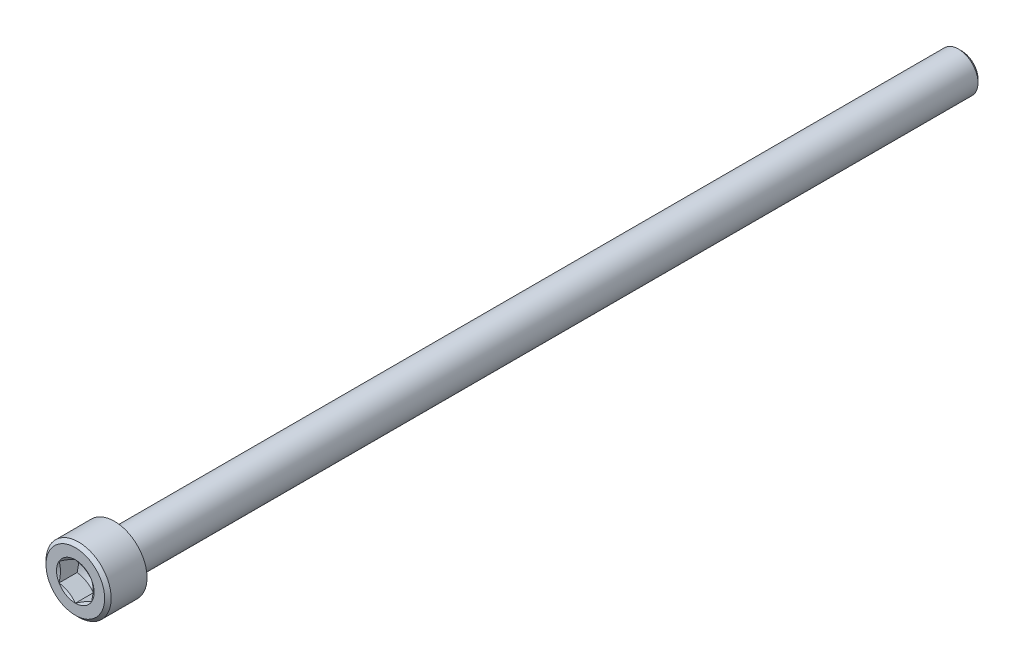
ISO-10303-21;
HEADER;
FILE_DESCRIPTION(('STEP AP214'),'2;1');
FILE_NAME('part.step','',(''),(''),'','','');
FILE_SCHEMA(('AUTOMOTIVE_DESIGN { 1 0 10303 214 1 1 1 1 }'));
ENDSEC;
DATA;
#1=APPLICATION_CONTEXT('core data for automotive mechanical design processes');
#2=APPLICATION_PROTOCOL_DEFINITION('international standard','automotive_design',2000,#1);
#3=PRODUCT_CONTEXT('',#1,'mechanical');
#4=PRODUCT('Part','Part','',(#3));
#5=PRODUCT_RELATED_PRODUCT_CATEGORY('part','',(#4));
#6=PRODUCT_DEFINITION_FORMATION('','',#4);
#7=PRODUCT_DEFINITION_CONTEXT('part definition',#1,'design');
#8=PRODUCT_DEFINITION('design','',#6,#7);
#9=PRODUCT_DEFINITION_SHAPE('','',#8);
#10=(LENGTH_UNIT() NAMED_UNIT(*) SI_UNIT(.MILLI.,.METRE.));
#11=(NAMED_UNIT(*) PLANE_ANGLE_UNIT() SI_UNIT($,.RADIAN.));
#12=(NAMED_UNIT(*) SI_UNIT($,.STERADIAN.) SOLID_ANGLE_UNIT());
#13=UNCERTAINTY_MEASURE_WITH_UNIT(LENGTH_MEASURE(1.E-05),#10,'distance_accuracy_value','');
#14=(GEOMETRIC_REPRESENTATION_CONTEXT(3) GLOBAL_UNCERTAINTY_ASSIGNED_CONTEXT((#13)) GLOBAL_UNIT_ASSIGNED_CONTEXT((#10,
#11,#12)) REPRESENTATION_CONTEXT('',''));
#15=CARTESIAN_POINT('',(0.,0.,0.));
#16=DIRECTION('',(0.,0.,1.));
#17=DIRECTION('',(1.,0.,0.));
#18=AXIS2_PLACEMENT_3D('',#15,#16,#17);
#19=CARTESIAN_POINT('',(0.,5.,6.));
#20=DIRECTION('',(0.,0.,-1.));
#21=DIRECTION('',(0.,1.,0.));
#22=AXIS2_PLACEMENT_3D('',#19,#20,#21);
#23=PLANE('',#22);
#24=CARTESIAN_POINT('',(0.,0.,6.));
#25=DIRECTION('',(0.,0.,-1.));
#26=DIRECTION('',(0.,1.,0.));
#27=AXIS2_PLACEMENT_3D('',#24,#25,#26);
#28=CIRCLE('',#27,4.50000000000001);
#29=CARTESIAN_POINT('',(0.,4.50000000000001,6.));
#30=VERTEX_POINT('',#29);
#31=EDGE_CURVE('E284',#30,#30,#28,.F.);
#32=ORIENTED_EDGE('',*,*,#31,.T.);
#33=EDGE_LOOP('',(#32));
#34=FACE_BOUND('',#33,.T.);
#35=CARTESIAN_POINT('',(0.,0.,6.));
#36=DIRECTION('',(0.,0.,-1.));
#37=DIRECTION('',(0.,1.,0.));
#38=AXIS2_PLACEMENT_3D('',#35,#36,#37);
#39=CIRCLE('',#38,2.88675134594813);
#40=CARTESIAN_POINT('',(0.,2.88675134594813,6.));
#41=VERTEX_POINT('',#40);
#42=CARTESIAN_POINT('',(-2.5,1.44337567297407,6.));
#43=VERTEX_POINT('',#42);
#44=EDGE_CURVE('E105',#41,#43,#39,.F.);
#45=ORIENTED_EDGE('',*,*,#44,.F.);
#46=CARTESIAN_POINT('',(2.5,1.44337567297406,6.));
#47=VERTEX_POINT('',#46);
#48=EDGE_CURVE('E93',#47,#41,#39,.F.);
#49=ORIENTED_EDGE('',*,*,#48,.F.);
#50=CARTESIAN_POINT('',(2.5,-1.44337567297406,6.));
#51=VERTEX_POINT('',#50);
#52=EDGE_CURVE('E103',#51,#47,#39,.F.);
#53=ORIENTED_EDGE('',*,*,#52,.F.);
#54=CARTESIAN_POINT('',(0.,-2.88675134594813,6.));
#55=VERTEX_POINT('',#54);
#56=EDGE_CURVE('E451',#55,#51,#39,.F.);
#57=ORIENTED_EDGE('',*,*,#56,.F.);
#58=CARTESIAN_POINT('',(-2.5,-1.44337567297502,5.99999999999936));
#59=VERTEX_POINT('',#58);
#60=EDGE_CURVE('E140',#59,#55,#39,.F.);
#61=ORIENTED_EDGE('',*,*,#60,.F.);
#62=EDGE_CURVE('E135',#43,#59,#39,.F.);
#63=ORIENTED_EDGE('',*,*,#62,.F.);
#64=EDGE_LOOP('',(#45,#49,#53,#57,#61,#63));
#65=FACE_BOUND('',#64,.T.);
#66=ADVANCED_FACE('F36',(#34,#65),#23,.F.);
#67=CARTESIAN_POINT('',(0.,3.,0.));
#68=DIRECTION('',(0.,0.,1.));
#69=DIRECTION('',(0.,-1.,0.));
#70=AXIS2_PLACEMENT_3D('',#67,#68,#69);
#71=PLANE('',#70);
#72=CARTESIAN_POINT('',(0.,0.,0.));
#73=DIRECTION('',(0.,0.,1.));
#74=DIRECTION('',(0.,-1.,0.));
#75=AXIS2_PLACEMENT_3D('',#72,#73,#74);
#76=CIRCLE('',#75,3.25);
#77=CARTESIAN_POINT('',(0.,-3.25,0.));
#78=VERTEX_POINT('',#77);
#79=EDGE_CURVE('E45',#78,#78,#76,.T.);
#80=ORIENTED_EDGE('',*,*,#79,.T.);
#81=EDGE_LOOP('',(#80));
#82=FACE_BOUND('',#81,.T.);
#83=CARTESIAN_POINT('',(0.,0.,0.));
#84=DIRECTION('',(0.,0.,1.));
#85=DIRECTION('',(0.,-1.,0.));
#86=AXIS2_PLACEMENT_3D('',#83,#84,#85);
#87=CIRCLE('',#86,5.);
#88=CARTESIAN_POINT('',(0.,-5.,0.));
#89=VERTEX_POINT('',#88);
#90=EDGE_CURVE('E480',#89,#89,#87,.T.);
#91=ORIENTED_EDGE('',*,*,#90,.F.);
#92=EDGE_LOOP('',(#91));
#93=FACE_BOUND('',#92,.T.);
#94=ADVANCED_FACE('F244',(#82,#93),#71,.F.);
#95=CARTESIAN_POINT('',(0.,0.,6.));
#96=DIRECTION('',(0.,0.,1.));
#97=DIRECTION('',(0.,-1.,0.));
#98=AXIS2_PLACEMENT_3D('',#95,#96,#97);
#99=CYLINDRICAL_SURFACE('',#98,5.);
#100=CARTESIAN_POINT('',(0.,0.,5.50000000000001));
#101=DIRECTION('',(0.,0.,-1.));
#102=DIRECTION('',(0.,1.,0.));
#103=AXIS2_PLACEMENT_3D('',#100,#101,#102);
#104=CIRCLE('',#103,5.);
#105=CARTESIAN_POINT('',(0.,5.,5.50000000000001));
#106=VERTEX_POINT('',#105);
#107=EDGE_CURVE('E277',#106,#106,#104,.T.);
#108=ORIENTED_EDGE('',*,*,#107,.T.);
#109=EDGE_LOOP('',(#108));
#110=FACE_BOUND('',#109,.T.);
#111=ORIENTED_EDGE('',*,*,#90,.T.);
#112=EDGE_LOOP('',(#111));
#113=FACE_BOUND('',#112,.T.);
#114=ADVANCED_FACE('F250',(#110,#113),#99,.T.);
#115=CARTESIAN_POINT('',(0.,0.,-130.));
#116=DIRECTION('',(0.,0.,1.));
#117=DIRECTION('',(0.,-1.,0.));
#118=AXIS2_PLACEMENT_3D('',#115,#116,#117);
#119=PLANE('',#118);
#120=CARTESIAN_POINT('',(0.,0.,-130.));
#121=DIRECTION('',(0.,0.,1.));
#122=DIRECTION('',(0.,-1.,0.));
#123=AXIS2_PLACEMENT_3D('',#120,#121,#122);
#124=CIRCLE('',#123,2.50000000000001);
#125=CARTESIAN_POINT('',(0.,-2.50000000000001,-130.));
#126=VERTEX_POINT('',#125);
#127=EDGE_CURVE('E116',#126,#126,#124,.F.);
#128=ORIENTED_EDGE('',*,*,#127,.T.);
#129=EDGE_LOOP('',(#128));
#130=FACE_BOUND('',#129,.T.);
#131=ADVANCED_FACE('F255',(#130),#119,.F.);
#132=CARTESIAN_POINT('',(0.,0.,6.));
#133=DIRECTION('',(0.,0.,1.));
#134=DIRECTION('',(0.,-1.,0.));
#135=AXIS2_PLACEMENT_3D('',#132,#133,#134);
#136=CYLINDRICAL_SURFACE('',#135,3.);
#137=CARTESIAN_POINT('',(0.,0.,-0.25));
#138=DIRECTION('',(0.,0.,1.));
#139=DIRECTION('',(0.,-1.,0.));
#140=AXIS2_PLACEMENT_3D('',#137,#138,#139);
#141=CIRCLE('',#140,3.);
#142=CARTESIAN_POINT('',(0.,-3.,-0.25));
#143=VERTEX_POINT('',#142);
#144=EDGE_CURVE('E12',#143,#143,#141,.F.);
#145=ORIENTED_EDGE('',*,*,#144,.T.);
#146=EDGE_LOOP('',(#145));
#147=FACE_BOUND('',#146,.T.);
#148=CARTESIAN_POINT('',(0.,0.,-129.5));
#149=DIRECTION('',(0.,0.,1.));
#150=DIRECTION('',(0.,-1.,0.));
#151=AXIS2_PLACEMENT_3D('',#148,#149,#150);
#152=CIRCLE('',#151,3.);
#153=CARTESIAN_POINT('',(0.,-3.,-129.5));
#154=VERTEX_POINT('',#153);
#155=EDGE_CURVE('E274',#154,#154,#152,.T.);
#156=ORIENTED_EDGE('',*,*,#155,.T.);
#157=EDGE_LOOP('',(#156));
#158=FACE_BOUND('',#157,.T.);
#159=ADVANCED_FACE('F172',(#147,#158),#136,.T.);
#160=CARTESIAN_POINT('',(0.,0.,6.));
#161=DIRECTION('',(0.,0.,-1.));
#162=DIRECTION('',(0.,1.,0.));
#163=AXIS2_PLACEMENT_3D('',#160,#161,#162);
#164=CONICAL_SURFACE('',#163,4.50000000000001,0.785398163397447);
#165=ORIENTED_EDGE('',*,*,#107,.F.);
#166=EDGE_LOOP('',(#165));
#167=FACE_BOUND('',#166,.T.);
#168=ORIENTED_EDGE('',*,*,#31,.F.);
#169=EDGE_LOOP('',(#168));
#170=FACE_BOUND('',#169,.T.);
#171=ADVANCED_FACE('F259',(#167,#170),#164,.T.);
#172=CARTESIAN_POINT('',(0.,0.,-129.5));
#173=DIRECTION('',(0.,0.,1.));
#174=DIRECTION('',(0.,-1.,0.));
#175=AXIS2_PLACEMENT_3D('',#172,#173,#174);
#176=CONICAL_SURFACE('',#175,3.,0.785398163397438);
#177=ORIENTED_EDGE('',*,*,#127,.F.);
#178=EDGE_LOOP('',(#177));
#179=FACE_BOUND('',#178,.T.);
#180=ORIENTED_EDGE('',*,*,#155,.F.);
#181=EDGE_LOOP('',(#180));
#182=FACE_BOUND('',#181,.T.);
#183=ADVANCED_FACE('F261',(#179,#182),#176,.T.);
#184=CARTESIAN_POINT('',(0.,0.,5.7767090063074));
#185=DIRECTION('',(0.,0.,1.));
#186=DIRECTION('',(0.,-1.,0.));
#187=AXIS2_PLACEMENT_3D('',#184,#185,#186);
#188=CONICAL_SURFACE('',#187,2.5,1.04719755119659);
#189=ORIENTED_EDGE('',*,*,#44,.T.);
#190=CARTESIAN_POINT('',(-2.5002,1.44326020292023,6.00006667066651));
#191=CARTESIAN_POINT('',(-2.39033676526513,1.50668977106845,5.96343062641502));
#192=CARTESIAN_POINT('',(-2.27952520010347,1.57066685804385,5.93011122527245));
#193=CARTESIAN_POINT('',(-2.05598316653395,1.69972891130041,5.87195129186525));
#194=CARTESIAN_POINT('',(-1.94324872547161,1.7648161711947,5.84713133545513));
#195=CARTESIAN_POINT('',(-1.71917700612473,1.8941840386774,5.80849465774845));
#196=CARTESIAN_POINT('',(-1.60787420823262,1.95844473900197,5.79442080249303));
#197=CARTESIAN_POINT('',(-1.38474477253166,2.08726857876805,5.77761815866015));
#198=CARTESIAN_POINT('',(-1.27291894598577,2.15183124982667,5.77487545751102));
#199=CARTESIAN_POINT('',(-1.06395802444848,2.27247489412634,5.78057476631545));
#200=CARTESIAN_POINT('',(-0.966791682442266,2.32857390783979,5.78761740068926));
#201=CARTESIAN_POINT('',(-0.773092050288996,2.44040644260542,5.80994042543234));
#202=CARTESIAN_POINT('',(-0.676559430340266,2.4961395767184,5.82522844474766));
#203=CARTESIAN_POINT('',(-0.482460278259523,2.60820277442169,5.86344810015182));
#204=CARTESIAN_POINT('',(-0.384918318217859,2.66451865130903,5.88654178243291));
#205=CARTESIAN_POINT('',(-0.191289391923915,2.77631036402774,5.93895566288531));
#206=CARTESIAN_POINT('',(-0.0951999441138238,2.83178763258718,5.96826354193195));
#207=CARTESIAN_POINT('',(0.000200000000000195,2.88686681600197,6.00006667066651));
#208=B_SPLINE_CURVE_WITH_KNOTS('',3,(#190,#191,#192,#193,#194,#195,#196,#197,#198,#199,#200,
#201,#202,#203,#204,#205,#206,#207),.UNSPECIFIED.,.F.,.F.,(4,2,2,2,2,2,2,2,4),(0.,
0.396285827362227,0.793524330152053,1.18093086852114,1.56786160134476,1.90479741793733,
2.24204551660463,2.58677531536756,2.93082800105256),.UNSPECIFIED.);
#209=EDGE_CURVE('E109',#43,#41,#208,.T.);
#210=ORIENTED_EDGE('',*,*,#209,.T.);
#211=EDGE_LOOP('',(#189,#210));
#212=FACE_BOUND('',#211,.T.);
#213=ADVANCED_FACE('F110',(#212),#188,.F.);
#214=ORIENTED_EDGE('',*,*,#62,.T.);
#215=CARTESIAN_POINT('',(-2.5,-3.8280449937249,6.97302576958309));
#216=CARTESIAN_POINT('',(-2.5,-3.7182808564923,6.91998167553699));
#217=CARTESIAN_POINT('',(-2.5,-3.60825720059611,6.8674648836873));
#218=CARTESIAN_POINT('',(-2.5,-3.38755052986278,6.76378722305589));
#219=CARTESIAN_POINT('',(-2.5,-3.27686740487511,6.71262658903718));
#220=CARTESIAN_POINT('',(-2.5,-3.05410357304014,6.61169304571925));
#221=CARTESIAN_POINT('',(-2.5,-2.94201849305906,6.56192975322204));
#222=CARTESIAN_POINT('',(-2.5,-2.71692709217093,6.46454062219532));
#223=CARTESIAN_POINT('',(-2.5,-2.60392081964764,6.41691467225014));
#224=CARTESIAN_POINT('',(-2.5,-2.37540441715663,6.32380316280409));
#225=CARTESIAN_POINT('',(-2.5,-2.25988058014283,6.2783510589425));
#226=CARTESIAN_POINT('',(-2.5,-2.02747029246906,6.19100665065722));
#227=CARTESIAN_POINT('',(-2.5,-1.91058369184926,6.14911474228664));
#228=CARTESIAN_POINT('',(-2.5,-1.67550198908655,6.07001634907686));
#229=CARTESIAN_POINT('',(-2.5,-1.55731027320578,6.03279990304744));
#230=CARTESIAN_POINT('',(-2.5,-1.31924659147454,5.96426110414784));
#231=CARTESIAN_POINT('',(-2.5,-1.19937516991139,5.93293688735548));
#232=CARTESIAN_POINT('',(-2.5,-0.957870204364199,5.87770325315376));
#233=CARTESIAN_POINT('',(-2.5,-0.836236200198253,5.85379581003031));
#234=CARTESIAN_POINT('',(-2.5,-0.591501703670775,5.81500540375892));
#235=CARTESIAN_POINT('',(-2.5,-0.468401210012781,5.80012244858975));
#236=CARTESIAN_POINT('',(-2.5,-0.222157493517872,5.78069763952581));
#237=CARTESIAN_POINT('',(-2.5,-0.0990195694341574,5.77609031833175));
#238=CARTESIAN_POINT('',(-2.5,0.147170053504283,5.77746154779163));
#239=CARTESIAN_POINT('',(-2.5,0.270221766444751,5.78343735056697));
#240=CARTESIAN_POINT('',(-2.5,0.480350397015566,5.80225821544085));
#241=CARTESIAN_POINT('',(-2.5,0.567659136488241,5.81265231633479));
#242=CARTESIAN_POINT('',(-2.5,0.741602181646435,5.83809238777401));
#243=CARTESIAN_POINT('',(-2.5,0.828236378755897,5.85313909196885));
#244=CARTESIAN_POINT('',(-2.5,1.08705653408058,5.90446842565118));
#245=CARTESIAN_POINT('',(-2.5,1.25802931580402,5.94692706032299));
#246=CARTESIAN_POINT('',(-2.5,1.51386408134024,6.02015673088049));
#247=CARTESIAN_POINT('',(-2.5,1.60005960225907,6.0465302199395));
#248=CARTESIAN_POINT('',(-2.5,1.7715509943832,6.10188686894956));
#249=CARTESIAN_POINT('',(-2.5,1.85684744139665,6.13086822892402));
#250=CARTESIAN_POINT('',(-2.5,2.02618400322653,6.19083756829486));
#251=CARTESIAN_POINT('',(-2.5,2.11022848716712,6.22181333490311));
#252=CARTESIAN_POINT('',(-2.5,2.27766538220508,6.28558297742634));
#253=CARTESIAN_POINT('',(-2.5,2.36105751399552,6.31837758815925));
#254=CARTESIAN_POINT('',(-2.5,2.44414811866612,6.35190213539576));
#255=B_SPLINE_CURVE_WITH_KNOTS('',3,(#215,#216,#217,#218,#219,#220,#221,#222,#223,#224,#225,
#226,#227,#228,#229,#230,#231,#232,#233,#234,#235,#236,#237,#238,#239,#240,#241,#242,#243,#244,
#245,#246,#247,#248,#249,#250,#251,#252,#253,#254),.UNSPECIFIED.,.F.,.F.,(4,2,2,2,2,2,2,2,2,2,2,
2,2,2,2,2,2,2,2,4),(0.,0.365732370332687,0.731527644124578,1.09941621653749,1.46728558928024,
1.83967125623437,2.21209829506693,2.58371790436015,2.95521975869687,3.32682041917424,
3.69842140819281,4.06764803658798,4.43677881037457,4.70042588015974,4.96411454456794,
5.49188432099904,5.76228301186062,6.03249648197688,6.30118900914354,6.56999089095287),.UNSPECIFIED.);
#256=EDGE_CURVE('E227',#59,#43,#255,.T.);
#257=ORIENTED_EDGE('',*,*,#256,.T.);
#258=EDGE_LOOP('',(#214,#257));
#259=FACE_BOUND('',#258,.T.);
#260=ADVANCED_FACE('F268',(#259),#188,.F.);
#261=ORIENTED_EDGE('',*,*,#60,.T.);
#262=CARTESIAN_POINT('',(0.000200000000001086,-2.88686681600197,6.00006667066651));
#263=CARTESIAN_POINT('',(-0.10966323473487,-2.82343724785375,5.96343062641502));
#264=CARTESIAN_POINT('',(-0.220474799896525,-2.75946016087834,5.93011122527245));
#265=CARTESIAN_POINT('',(-0.444016833466049,-2.63039810762178,5.87195129186525));
#266=CARTESIAN_POINT('',(-0.556751274528388,-2.5653108477275,5.84713133545513));
#267=CARTESIAN_POINT('',(-0.78082299387527,-2.43594298024479,5.80849465774845));
#268=CARTESIAN_POINT('',(-0.892125791767378,-2.37168227992022,5.79442080249303));
#269=CARTESIAN_POINT('',(-1.11525522746834,-2.24285844015415,5.77761815866014));
#270=CARTESIAN_POINT('',(-1.22708105401423,-2.17829576909552,5.77487545751102));
#271=CARTESIAN_POINT('',(-1.43604197555152,-2.05765212479586,5.78057476631545));
#272=CARTESIAN_POINT('',(-1.53320831755773,-2.0015531110824,5.78761740068926));
#273=CARTESIAN_POINT('',(-1.726907949711,-1.88972057631678,5.80994042543234));
#274=CARTESIAN_POINT('',(-1.82344056965973,-1.8339874422038,5.82522844474766));
#275=CARTESIAN_POINT('',(-2.01753972174048,-1.7219242445005,5.86344810015182));
#276=CARTESIAN_POINT('',(-2.11508168178214,-1.66560836761316,5.88654178243291));
#277=CARTESIAN_POINT('',(-2.30871060807608,-1.55381665489446,5.93895566288531));
#278=CARTESIAN_POINT('',(-2.40480005588618,-1.49833938633502,5.96826354193195));
#279=CARTESIAN_POINT('',(-2.5002,-1.44326020292023,6.00006667066651));
#280=B_SPLINE_CURVE_WITH_KNOTS('',3,(#262,#263,#264,#265,#266,#267,#268,#269,#270,#271,#272,
#273,#274,#275,#276,#277,#278,#279),.UNSPECIFIED.,.F.,.F.,(4,2,2,2,2,2,2,2,4),(0.,
0.396285827362228,0.793524330152053,1.18093086852114,1.56786160134476,1.90479741793733,
2.24204551660463,2.58677531536756,2.93082800105257),.UNSPECIFIED.);
#281=EDGE_CURVE('E221',#55,#59,#280,.T.);
#282=ORIENTED_EDGE('',*,*,#281,.T.);
#283=EDGE_LOOP('',(#261,#282));
#284=FACE_BOUND('',#283,.T.);
#285=ADVANCED_FACE('F381',(#284),#188,.F.);
#286=ORIENTED_EDGE('',*,*,#56,.T.);
#287=CARTESIAN_POINT('',(2.5002,-1.44326020292023,6.00006667066651));
#288=CARTESIAN_POINT('',(2.39033676526513,-1.50668977106845,5.96343062641502));
#289=CARTESIAN_POINT('',(2.27952520010347,-1.57066685804385,5.93011122527245));
#290=CARTESIAN_POINT('',(2.05598316653395,-1.69972891130041,5.87195129186525));
#291=CARTESIAN_POINT('',(1.94324872547161,-1.7648161711947,5.84713133545513));
#292=CARTESIAN_POINT('',(1.71917700612473,-1.8941840386774,5.80849465774845));
#293=CARTESIAN_POINT('',(1.60787420823262,-1.95844473900197,5.79442080249303));
#294=CARTESIAN_POINT('',(1.38474477253166,-2.08726857876805,5.77761815866015));
#295=CARTESIAN_POINT('',(1.27291894598577,-2.15183124982667,5.77487545751102));
#296=CARTESIAN_POINT('',(1.06395802444848,-2.27247489412634,5.78057476631545));
#297=CARTESIAN_POINT('',(0.966791682442267,-2.32857390783979,5.78761740068926));
#298=CARTESIAN_POINT('',(0.773092050288996,-2.44040644260542,5.80994042543234));
#299=CARTESIAN_POINT('',(0.676559430340266,-2.4961395767184,5.82522844474766));
#300=CARTESIAN_POINT('',(0.482460278259523,-2.60820277442169,5.86344810015182));
#301=CARTESIAN_POINT('',(0.384918318217859,-2.66451865130903,5.88654178243292));
#302=CARTESIAN_POINT('',(0.191289391923915,-2.77631036402774,5.93895566288531));
#303=CARTESIAN_POINT('',(0.0951999441138246,-2.83178763258717,5.96826354193195));
#304=CARTESIAN_POINT('',(-0.000199999999999224,-2.88686681600197,6.00006667066651));
#305=B_SPLINE_CURVE_WITH_KNOTS('',3,(#287,#288,#289,#290,#291,#292,#293,#294,#295,#296,#297,
#298,#299,#300,#301,#302,#303,#304),.UNSPECIFIED.,.F.,.F.,(4,2,2,2,2,2,2,2,4),(0.,
0.396285827362228,0.793524330152053,1.18093086852114,1.56786160134476,1.90479741793733,
2.24204551660463,2.58677531536756,2.93082800105256),.UNSPECIFIED.);
#306=EDGE_CURVE('E57',#51,#55,#305,.T.);
#307=ORIENTED_EDGE('',*,*,#306,.T.);
#308=EDGE_LOOP('',(#286,#307));
#309=FACE_BOUND('',#308,.T.);
#310=ADVANCED_FACE('F389',(#309),#188,.F.);
#311=ORIENTED_EDGE('',*,*,#52,.T.);
#312=CARTESIAN_POINT('',(2.5,-3.82804588606158,6.97302620093449));
#313=CARTESIAN_POINT('',(2.5,-3.71828171828268,6.91998208843203));
#314=CARTESIAN_POINT('',(2.5,-3.60825803181684,6.86746527813683));
#315=CARTESIAN_POINT('',(2.5,-3.38755129984201,6.76378758071264));
#316=CARTESIAN_POINT('',(2.5,-3.27686814418247,6.71262692834667));
#317=CARTESIAN_POINT('',(2.5,-3.05410425049089,6.61169334832497));
#318=CARTESIAN_POINT('',(2.5,-2.94201913932292,6.56193003747517));
#319=CARTESIAN_POINT('',(2.5,-2.71692767582903,6.46454087008096));
#320=CARTESIAN_POINT('',(2.5,-2.60392137188689,6.41691490212086));
#321=CARTESIAN_POINT('',(2.5,-2.37540490571202,6.32380335695479));
#322=CARTESIAN_POINT('',(2.5,-2.25988103642781,6.27835123539776));
#323=CARTESIAN_POINT('',(2.5,-2.02747068367306,6.19100679270298));
#324=CARTESIAN_POINT('',(2.5,-1.91058405024255,6.1491148676187));
#325=CARTESIAN_POINT('',(2.5,-1.67550228123859,6.07001644264555));
#326=CARTESIAN_POINT('',(2.5,-1.55731053192955,6.03279998156106));
#327=CARTESIAN_POINT('',(2.5,-1.31924678242158,5.96426115509875));
#328=CARTESIAN_POINT('',(2.5,-1.19937532651053,5.9329369257971));
#329=CARTESIAN_POINT('',(2.5,-0.957870273262473,5.87770326628756));
#330=CARTESIAN_POINT('',(2.5,-0.836236215486562,5.85379581146796));
#331=CARTESIAN_POINT('',(2.5,-0.591501610534911,5.81500538998051));
#332=CARTESIAN_POINT('',(2.5,-0.468401062063661,5.80012243128558));
#333=CARTESIAN_POINT('',(2.5,-0.22215723620717,5.78069762481882));
#334=CARTESIAN_POINT('',(2.5,-0.0990192575787284,5.77609030966701));
#335=CARTESIAN_POINT('',(2.5,0.1471704735209,5.77746156052538));
#336=CARTESIAN_POINT('',(2.5,0.270222240078057,5.78343737865902));
#337=CARTESIAN_POINT('',(2.5,0.480350939206177,5.80225827428052));
#338=CARTESIAN_POINT('',(2.5,0.567659694215581,5.81265238748117));
#339=CARTESIAN_POINT('',(2.5,0.741602769794541,5.8380924842116));
#340=CARTESIAN_POINT('',(2.5,0.828236981787935,5.85313920139105));
#341=CARTESIAN_POINT('',(2.5,1.08705718104795,5.90446857434287));
#342=CARTESIAN_POINT('',(2.5,1.25802999101339,5.94692723558926));
#343=CARTESIAN_POINT('',(2.5,1.51386479875968,6.02015694545726));
#344=CARTESIAN_POINT('',(2.5,1.60006033398193,6.04653044771448));
#345=CARTESIAN_POINT('',(2.5,1.77155175455052,6.10188712274017));
#346=CARTESIAN_POINT('',(2.5,1.85684821570523,6.13086849553187));
#347=CARTESIAN_POINT('',(2.5,2.02618480561253,6.19083786003536));
#348=CARTESIAN_POINT('',(2.5,2.11022930349026,6.22181363895937));
#349=CARTESIAN_POINT('',(2.5,2.27766622643295,6.28558330574319));
#350=CARTESIAN_POINT('',(2.5,2.36105837219078,6.31837792842132));
#351=CARTESIAN_POINT('',(2.5,2.44414899085237,6.35190248741952));
#352=B_SPLINE_CURVE_WITH_KNOTS('',3,(#312,#313,#314,#315,#316,#317,#318,#319,#320,#321,#322,
#323,#324,#325,#326,#327,#328,#329,#330,#331,#332,#333,#334,#335,#336,#337,#338,#339,#340,#341,
#342,#343,#344,#345,#346,#347,#348,#349,#350,#351),.UNSPECIFIED.,.F.,.F.,(4,2,2,2,2,2,2,2,2,2,2,
2,2,2,2,2,2,2,2,4),(0.,0.365732476934658,0.731527857346204,1.09941653761223,1.46728601819945,
1.83967179466916,2.21209894305431,2.58371866150582,2.95522062491228,3.32682144960046,
3.69842260258812,4.06764939320248,4.4367803293227,4.700427449745,4.9641161647987,
5.49188604280505,5.76228478630214,6.03249830897401,6.30119088816191,6.56999282209524),.UNSPECIFIED.);
#353=EDGE_CURVE('E51',#47,#51,#352,.F.);
#354=ORIENTED_EDGE('',*,*,#353,.T.);
#355=EDGE_LOOP('',(#311,#354));
#356=FACE_BOUND('',#355,.T.);
#357=ADVANCED_FACE('F397',(#356),#188,.F.);
#358=ORIENTED_EDGE('',*,*,#48,.T.);
#359=CARTESIAN_POINT('',(-0.000200000000000008,2.88686681600197,6.00006667066651));
#360=CARTESIAN_POINT('',(0.109663234734871,2.82343724785375,5.96343062641502));
#361=CARTESIAN_POINT('',(0.220474799896526,2.75946016087834,5.93011122527245));
#362=CARTESIAN_POINT('',(0.44401683346605,2.63039810762178,5.87195129186525));
#363=CARTESIAN_POINT('',(0.556751274528389,2.5653108477275,5.84713133545513));
#364=CARTESIAN_POINT('',(0.78082299387527,2.43594298024479,5.80849465774845));
#365=CARTESIAN_POINT('',(0.892125791767379,2.37168227992022,5.79442080249303));
#366=CARTESIAN_POINT('',(1.11525522746834,2.24285844015415,5.77761815866014));
#367=CARTESIAN_POINT('',(1.22708105401423,2.17829576909552,5.77487545751102));
#368=CARTESIAN_POINT('',(1.43604197555152,2.05765212479585,5.78057476631545));
#369=CARTESIAN_POINT('',(1.53320831755773,2.0015531110824,5.78761740068926));
#370=CARTESIAN_POINT('',(1.726907949711,1.88972057631678,5.80994042543234));
#371=CARTESIAN_POINT('',(1.82344056965973,1.8339874422038,5.82522844474766));
#372=CARTESIAN_POINT('',(2.01753972174048,1.7219242445005,5.86344810015182));
#373=CARTESIAN_POINT('',(2.11508168178214,1.66560836761316,5.88654178243291));
#374=CARTESIAN_POINT('',(2.30871060807608,1.55381665489446,5.93895566288531));
#375=CARTESIAN_POINT('',(2.40480005588618,1.49833938633502,5.96826354193195));
#376=CARTESIAN_POINT('',(2.5002,1.44326020292023,6.00006667066651));
#377=B_SPLINE_CURVE_WITH_KNOTS('',3,(#359,#360,#361,#362,#363,#364,#365,#366,#367,#368,#369,
#370,#371,#372,#373,#374,#375,#376),.UNSPECIFIED.,.F.,.F.,(4,2,2,2,2,2,2,2,4),(0.,
0.396285827362228,0.793524330152053,1.18093086852114,1.56786160134476,1.90479741793733,
2.24204551660463,2.58677531536756,2.93082800105256),.UNSPECIFIED.);
#378=EDGE_CURVE('E97',#41,#47,#377,.T.);
#379=ORIENTED_EDGE('',*,*,#378,.T.);
#380=EDGE_LOOP('',(#358,#379));
#381=FACE_BOUND('',#380,.T.);
#382=ADVANCED_FACE('F95',(#381),#188,.F.);
#383=CARTESIAN_POINT('',(0.,0.,1.55662432702594));
#384=DIRECTION('',(0.,0.,1.));
#385=DIRECTION('',(1.,0.,0.));
#386=AXIS2_PLACEMENT_3D('',#383,#384,#385);
#387=CONICAL_SURFACE('',#386,0.,1.0471975511966);
#388=CARTESIAN_POINT('',(2.5002,-1.44326020292023,3.22335766435911));
#389=CARTESIAN_POINT('',(2.39033676526513,-1.50668977106845,3.18672162010763));
#390=CARTESIAN_POINT('',(2.27952520010347,-1.57066685804385,3.15340221896506));
#391=CARTESIAN_POINT('',(2.05598316653395,-1.69972891130041,3.09524228555786));
#392=CARTESIAN_POINT('',(1.94324872547161,-1.7648161711947,3.07042232914774));
#393=CARTESIAN_POINT('',(1.71917700612473,-1.8941840386774,3.03178565144105));
#394=CARTESIAN_POINT('',(1.60787420823262,-1.95844473900197,3.01771179618564));
#395=CARTESIAN_POINT('',(1.38474477253167,-2.08726857876804,3.00090915235275));
#396=CARTESIAN_POINT('',(1.27291894598577,-2.15183124982667,2.99816645120363));
#397=CARTESIAN_POINT('',(1.06395802444848,-2.27247489412634,3.00386576000805));
#398=CARTESIAN_POINT('',(0.966791682442269,-2.32857390783979,3.01090839438186));
#399=CARTESIAN_POINT('',(0.773092050288998,-2.44040644260542,3.03323141912494));
#400=CARTESIAN_POINT('',(0.676559430340268,-2.4961395767184,3.04851943844027));
#401=CARTESIAN_POINT('',(0.482460278259524,-2.60820277442169,3.08673909384442));
#402=CARTESIAN_POINT('',(0.38491831821786,-2.66451865130903,3.10983277612552));
#403=CARTESIAN_POINT('',(0.191289391923916,-2.77631036402774,3.16224665657791));
#404=CARTESIAN_POINT('',(0.0951999441138247,-2.83178763258717,3.19155453562455));
#405=CARTESIAN_POINT('',(-0.000199999999999363,-2.88686681600197,3.22335766435911));
#406=B_SPLINE_CURVE_WITH_KNOTS('',3,(#388,#389,#390,#391,#392,#393,#394,#395,#396,#397,#398,
#399,#400,#401,#402,#403,#404,#405),.UNSPECIFIED.,.F.,.F.,(4,2,2,2,2,2,2,2,4),(0.,
0.396285827362227,0.79352433015205,1.18093086852114,1.56786160134475,1.90479741793733,
2.24204551660463,2.58677531536756,2.93082800105256),.UNSPECIFIED.);
#407=CARTESIAN_POINT('',(2.5,-1.44337567297406,3.2232909936926));
#408=VERTEX_POINT('',#407);
#409=CARTESIAN_POINT('',(0.,-2.88675134594813,3.2232909936926));
#410=VERTEX_POINT('',#409);
#411=EDGE_CURVE('E185',#408,#410,#406,.T.);
#412=ORIENTED_EDGE('',*,*,#411,.F.);
#413=CARTESIAN_POINT('',(2.5,-3.85899097955328,4.21129388463403));
#414=CARTESIAN_POINT('',(2.5,-3.74985192447582,4.15842477796157));
#415=CARTESIAN_POINT('',(2.5,-3.64046016390611,4.10606828132413));
#416=CARTESIAN_POINT('',(2.5,-3.42103657226934,4.00266954236157));
#417=CARTESIAN_POINT('',(2.5,-3.31100464153032,3.95162751179188));
#418=CARTESIAN_POINT('',(2.5,-3.08959157528239,3.85088661152226));
#419=CARTESIAN_POINT('',(2.5,-2.97820634496779,3.80119671009831));
#420=CARTESIAN_POINT('',(2.5,-2.75454240460399,3.7038779964297));
#421=CARTESIAN_POINT('',(2.5,-2.6422637378838,3.65624908494574));
#422=CARTESIAN_POINT('',(2.5,-2.41328522954428,3.56222264874629));
#423=CARTESIAN_POINT('',(2.5,-2.29655301627865,3.51590352349467));
#424=CARTESIAN_POINT('',(2.5,-2.06171688989073,3.42681491866543));
#425=CARTESIAN_POINT('',(2.5,-1.94361282396759,3.38404583890867));
#426=CARTESIAN_POINT('',(2.5,-1.70607104319581,3.303191823257));
#427=CARTESIAN_POINT('',(2.5,-1.58663662441413,3.26509730195404));
#428=CARTESIAN_POINT('',(2.5,-1.3460561347031,3.19482566221233));
#429=CARTESIAN_POINT('',(2.5,-1.2249106202388,3.16264666562147));
#430=CARTESIAN_POINT('',(2.5,-0.981408207607517,3.10590664098747));
#431=CARTESIAN_POINT('',(2.5,-0.859059533705329,3.08131097332133));
#432=CARTESIAN_POINT('',(2.5,-0.612862334426346,3.04117645345352));
#433=CARTESIAN_POINT('',(2.5,-0.489013977089098,3.02563659596044));
#434=CARTESIAN_POINT('',(2.5,-0.242034115375475,3.00505547994876));
#435=CARTESIAN_POINT('',(2.5,-0.118913953382411,2.9998814562697));
#436=CARTESIAN_POINT('',(2.5,0.127331402032927,3.00012263452256));
#437=CARTESIAN_POINT('',(2.5,0.250456595189723,3.00553859006539));
#438=CARTESIAN_POINT('',(2.5,0.459885632722225,3.02337771416167));
#439=CARTESIAN_POINT('',(2.5,0.546416368226688,3.03328524031655));
#440=CARTESIAN_POINT('',(2.5,0.718829836619157,3.05770573301548));
#441=CARTESIAN_POINT('',(2.5,0.804712479437144,3.07221932805455));
#442=CARTESIAN_POINT('',(2.5,1.06126616671421,3.12190366049042));
#443=CARTESIAN_POINT('',(2.5,1.23076139578437,3.16321008958704));
#444=CARTESIAN_POINT('',(2.5,1.48445907111836,3.23471704893293));
#445=CARTESIAN_POINT('',(2.5,1.56997501987459,3.26052039900036));
#446=CARTESIAN_POINT('',(2.5,1.74017440726501,3.31476470920246));
#447=CARTESIAN_POINT('',(2.5,1.82485783878608,3.34320569185176));
#448=CARTESIAN_POINT('',(2.5,1.99342650623661,3.40227346790425));
#449=CARTESIAN_POINT('',(2.5,2.07731194910717,3.43289967607804));
#450=CARTESIAN_POINT('',(2.5,2.24438679821134,3.49597824276707));
#451=CARTESIAN_POINT('',(2.5,2.32757623773935,3.52843051334939));
#452=CARTESIAN_POINT('',(2.5,2.51890033598933,3.60509971331992));
#453=CARTESIAN_POINT('',(2.5,2.62681733255007,3.64985875626989));
#454=CARTESIAN_POINT('',(2.5,2.84176924783224,3.74145173265384));
#455=CARTESIAN_POINT('',(2.5,2.9488041197073,3.78828577545189));
#456=CARTESIAN_POINT('',(2.5,3.2688441131245,3.93127989880294));
#457=CARTESIAN_POINT('',(2.5,3.48074231011209,4.02991462158479));
#458=CARTESIAN_POINT('',(2.5,3.90259403926228,4.2315912061779));
#459=CARTESIAN_POINT('',(2.5,4.11254607985851,4.33463615500466));
#460=CARTESIAN_POINT('',(2.5,4.53095026046332,4.54373837173172));
#461=CARTESIAN_POINT('',(2.5,4.73940234642577,4.64979574750086));
#462=CARTESIAN_POINT('',(2.5,5.15570923222926,4.86431829530097));
#463=CARTESIAN_POINT('',(2.5,5.36356130293145,4.97278874677179));
#464=CARTESIAN_POINT('',(2.5,5.77843146907206,5.19132280797698));
#465=CARTESIAN_POINT('',(2.5,5.9854495434943,5.30138645754185));
#466=CARTESIAN_POINT('',(2.5,6.60536551874095,5.63325193111519));
#467=CARTESIAN_POINT('',(2.5,7.01731359099233,5.85682639007335));
#468=CARTESIAN_POINT('',(2.5,7.77369724446376,6.2707343262655));
#469=CARTESIAN_POINT('',(2.5,8.11836367864172,6.46064780429205));
#470=CARTESIAN_POINT('',(2.5,8.80695745529363,6.84191707601513));
#471=CARTESIAN_POINT('',(2.5,9.15088469395074,7.0332730572096));
#472=CARTESIAN_POINT('',(2.5,9.83667639489103,7.41616361055207));
#473=CARTESIAN_POINT('',(2.5,10.1785433190904,7.60769377855881));
#474=CARTESIAN_POINT('',(2.5,10.8617985612305,7.99149345163753));
#475=CARTESIAN_POINT('',(2.5,11.203186939899,8.18376284857053));
#476=CARTESIAN_POINT('',(2.5,11.5444258649637,8.37629608236337));
#477=B_SPLINE_CURVE_WITH_KNOTS('',3,(#413,#414,#415,#416,#417,#418,#419,#420,#421,#422,#423,
#424,#425,#426,#427,#428,#429,#430,#431,#432,#433,#434,#435,#436,#437,#438,#439,#440,#441,#442,
#443,#444,#445,#446,#447,#448,#449,#450,#451,#452,#453,#454,#455,#456,#457,#458,#459,#460,#461,
#462,#463,#464,#465,#466,#467,#468,#469,#470,#471,#472,#473,#474,#475,#476),.UNSPECIFIED.,.F.,
.F.,(4,2,2,2,2,2,2,2,2,2,2,2,2,2,2,2,2,2,2,2,2,2,2,2,2,2,2,2,2,2,2,4),(0.,0.363815331273403,
0.727688909740137,1.09357083311979,1.45943511916676,1.83614883265504,2.21290491580123,
2.58887505321819,2.9647256148888,3.33883299764046,3.7128988425722,4.08214223049306,
4.45141189570568,4.71257353019149,4.9737708153402,5.49641013189844,5.76436001720496,
6.03231218992189,6.30019286927381,6.56806066001558,6.91852438312867,7.2690065996608,
7.97010813308778,8.67170870863953,9.37333443882134,10.0766854532708,10.7800540822156,
12.1861540889844,13.3667268646098,14.5474558331396,15.7230445730799,16.8984674295808),.UNSPECIFIED.);
#478=CARTESIAN_POINT('',(2.5,1.44337567297406,3.2232909936926));
#479=VERTEX_POINT('',#478);
#480=EDGE_CURVE('E191',#479,#408,#477,.F.);
#481=ORIENTED_EDGE('',*,*,#480,.F.);
#482=CARTESIAN_POINT('',(-0.000200000000000008,2.88686681600197,3.22335766435911));
#483=CARTESIAN_POINT('',(0.109663234734871,2.82343724785375,3.18672162010763));
#484=CARTESIAN_POINT('',(0.220474799896526,2.75946016087834,3.15340221896506));
#485=CARTESIAN_POINT('',(0.444016833466049,2.63039810762178,3.09524228555786));
#486=CARTESIAN_POINT('',(0.556751274528388,2.5653108477275,3.07042232914774));
#487=CARTESIAN_POINT('',(0.780822993875268,2.43594298024479,3.03178565144105));
#488=CARTESIAN_POINT('',(0.892125791767376,2.37168227992023,3.01771179618564));
#489=CARTESIAN_POINT('',(1.11525522746833,2.24285844015415,3.00090915235275));
#490=CARTESIAN_POINT('',(1.22708105401423,2.17829576909553,2.99816645120363));
#491=CARTESIAN_POINT('',(1.43604197555152,2.05765212479586,3.00386576000805));
#492=CARTESIAN_POINT('',(1.53320831755773,2.0015531110824,3.01090839438186));
#493=CARTESIAN_POINT('',(1.726907949711,1.88972057631678,3.03323141912494));
#494=CARTESIAN_POINT('',(1.82344056965973,1.8339874422038,3.04851943844027));
#495=CARTESIAN_POINT('',(2.01753972174047,1.7219242445005,3.08673909384442));
#496=CARTESIAN_POINT('',(2.11508168178214,1.66560836761316,3.10983277612552));
#497=CARTESIAN_POINT('',(2.30871060807608,1.55381665489446,3.16224665657791));
#498=CARTESIAN_POINT('',(2.40480005588618,1.49833938633502,3.19155453562455));
#499=CARTESIAN_POINT('',(2.5002,1.44326020292023,3.22335766435911));
#500=B_SPLINE_CURVE_WITH_KNOTS('',3,(#482,#483,#484,#485,#486,#487,#488,#489,#490,#491,#492,
#493,#494,#495,#496,#497,#498,#499),.UNSPECIFIED.,.F.,.F.,(4,2,2,2,2,2,2,2,4),(0.,
0.396285827362226,0.79352433015205,1.18093086852114,1.56786160134475,1.90479741793733,
2.24204551660463,2.58677531536756,2.93082800105256),.UNSPECIFIED.);
#501=CARTESIAN_POINT('',(0.,2.88675134594813,3.2232909936926));
#502=VERTEX_POINT('',#501);
#503=EDGE_CURVE('E198',#502,#479,#500,.T.);
#504=ORIENTED_EDGE('',*,*,#503,.F.);
#505=CARTESIAN_POINT('',(-2.5002,1.44326020292023,3.22335766435911));
#506=CARTESIAN_POINT('',(-2.39033676526513,1.50668977106845,3.18672162010763));
#507=CARTESIAN_POINT('',(-2.27952520010347,1.57066685804385,3.15340221896506));
#508=CARTESIAN_POINT('',(-2.05598316653395,1.69972891130041,3.09524228555786));
#509=CARTESIAN_POINT('',(-1.94324872547161,1.7648161711947,3.07042232914774));
#510=CARTESIAN_POINT('',(-1.71917700612473,1.8941840386774,3.03178565144105));
#511=CARTESIAN_POINT('',(-1.60787420823262,1.95844473900197,3.01771179618564));
#512=CARTESIAN_POINT('',(-1.38474477253167,2.08726857876804,3.00090915235275));
#513=CARTESIAN_POINT('',(-1.27291894598577,2.15183124982667,2.99816645120363));
#514=CARTESIAN_POINT('',(-1.06395802444848,2.27247489412634,3.00386576000805));
#515=CARTESIAN_POINT('',(-0.966791682442269,2.32857390783979,3.01090839438186));
#516=CARTESIAN_POINT('',(-0.773092050288998,2.44040644260542,3.03323141912494));
#517=CARTESIAN_POINT('',(-0.676559430340268,2.49613957671839,3.04851943844027));
#518=CARTESIAN_POINT('',(-0.482460278259524,2.60820277442169,3.08673909384442));
#519=CARTESIAN_POINT('',(-0.38491831821786,2.66451865130903,3.10983277612552));
#520=CARTESIAN_POINT('',(-0.191289391923915,2.77631036402774,3.16224665657791));
#521=CARTESIAN_POINT('',(-0.0951999441138241,2.83178763258717,3.19155453562455));
#522=CARTESIAN_POINT('',(0.000199999999999798,2.88686681600197,3.22335766435911));
#523=B_SPLINE_CURVE_WITH_KNOTS('',3,(#505,#506,#507,#508,#509,#510,#511,#512,#513,#514,#515,
#516,#517,#518,#519,#520,#521,#522),.UNSPECIFIED.,.F.,.F.,(4,2,2,2,2,2,2,2,4),(0.,
0.396285827362227,0.793524330152051,1.18093086852114,1.56786160134475,1.90479741793733,
2.24204551660463,2.58677531536756,2.93082800105256),.UNSPECIFIED.);
#524=CARTESIAN_POINT('',(-2.5,1.44337567297407,3.2232909936926));
#525=VERTEX_POINT('',#524);
#526=EDGE_CURVE('E128',#525,#502,#523,.T.);
#527=ORIENTED_EDGE('',*,*,#526,.F.);
#528=CARTESIAN_POINT('',(-2.5,-3.85899097954414,4.2112938846296));
#529=CARTESIAN_POINT('',(-2.5,-3.74985192446698,4.15842477795732));
#530=CARTESIAN_POINT('',(-2.5,-3.64046016389758,4.10606828132007));
#531=CARTESIAN_POINT('',(-2.5,-3.42103657226143,4.00266954235788));
#532=CARTESIAN_POINT('',(-2.5,-3.31100464152272,3.95162751178838));
#533=CARTESIAN_POINT('',(-2.5,-3.08959157527541,3.85088661151913));
#534=CARTESIAN_POINT('',(-2.5,-2.97820634496113,3.80119671009536));
#535=CARTESIAN_POINT('',(-2.5,-2.75454240459796,3.70387799642712));
#536=CARTESIAN_POINT('',(-2.5,-2.64226373787809,3.65624908494334));
#537=CARTESIAN_POINT('',(-2.5,-2.41328522953922,3.56222264874427));
#538=CARTESIAN_POINT('',(-2.5,-2.29655301627393,3.51590352349282));
#539=CARTESIAN_POINT('',(-2.5,-2.06171688988669,3.42681491866394));
#540=CARTESIAN_POINT('',(-2.5,-1.94361282396389,3.38404583890736));
#541=CARTESIAN_POINT('',(-2.5,-1.7060710431928,3.30319182325603));
#542=CARTESIAN_POINT('',(-2.5,-1.58663662441147,3.26509730195322));
#543=CARTESIAN_POINT('',(-2.5,-1.34605613470115,3.1948256622118));
#544=CARTESIAN_POINT('',(-2.5,-1.2249106202372,3.16264666562107));
#545=CARTESIAN_POINT('',(-2.5,-0.98140820760683,3.10590664098733));
#546=CARTESIAN_POINT('',(-2.5,-0.859059533705194,3.08131097332132));
#547=CARTESIAN_POINT('',(-2.5,-0.612862334427327,3.04117645345367));
#548=CARTESIAN_POINT('',(-2.5,-0.489013977090643,3.02563659596063));
#549=CARTESIAN_POINT('',(-2.5,-0.24203411537814,3.00505547994892));
#550=CARTESIAN_POINT('',(-2.5,-0.118913953385632,2.99988145626981));
#551=CARTESIAN_POINT('',(-2.5,0.127331402028605,3.00012263452245));
#552=CARTESIAN_POINT('',(-2.5,0.250456595184856,3.00553859006513));
#553=CARTESIAN_POINT('',(-2.5,0.459885632716665,3.02337771416109));
#554=CARTESIAN_POINT('',(-2.5,0.546416368220975,3.03328524031585));
#555=CARTESIAN_POINT('',(-2.5,0.718829836613143,3.05770573301452));
#556=CARTESIAN_POINT('',(-2.5,0.804712479430982,3.07221932805346));
#557=CARTESIAN_POINT('',(-2.5,1.06126616670761,3.12190366048893));
#558=CARTESIAN_POINT('',(-2.5,1.23076139577749,3.16321008958529));
#559=CARTESIAN_POINT('',(-2.5,1.48445907111107,3.23471704893078));
#560=CARTESIAN_POINT('',(-2.5,1.56997501986716,3.26052039899808));
#561=CARTESIAN_POINT('',(-2.5,1.7401744072573,3.31476470919991));
#562=CARTESIAN_POINT('',(-2.5,1.82485783877822,3.34320569184909));
#563=CARTESIAN_POINT('',(-2.5,1.99342650622847,3.40227346790132));
#564=CARTESIAN_POINT('',(-2.5,2.0773119490989,3.43289967607498));
#565=CARTESIAN_POINT('',(-2.5,2.24438679820279,3.49597824276377));
#566=CARTESIAN_POINT('',(-2.5,2.32757623773065,3.52843051334597));
#567=CARTESIAN_POINT('',(-2.5,2.51890033598055,3.60509971331632));
#568=CARTESIAN_POINT('',(-2.5,2.62681733254135,3.64985875626624));
#569=CARTESIAN_POINT('',(-2.5,2.84176924782361,3.74145173265009));
#570=CARTESIAN_POINT('',(-2.5,2.94880411969872,3.78828577544811));
#571=CARTESIAN_POINT('',(-2.5,3.26884411311605,3.93127989879906));
#572=CARTESIAN_POINT('',(-2.5,3.48074231010373,4.02991462158087));
#573=CARTESIAN_POINT('',(-2.5,3.90259403925408,4.23159120617391));
#574=CARTESIAN_POINT('',(-2.5,4.11254607985039,4.33463615500065));
#575=CARTESIAN_POINT('',(-2.5,4.53095026045534,4.54373837172769));
#576=CARTESIAN_POINT('',(-2.5,4.73940234641786,4.64979574749682));
#577=CARTESIAN_POINT('',(-2.5,5.15570923222149,4.86431829529693));
#578=CARTESIAN_POINT('',(-2.5,5.36356130292375,4.97278874676776));
#579=CARTESIAN_POINT('',(-2.5,5.77843146906449,5.19132280797297));
#580=CARTESIAN_POINT('',(-2.5,5.9854495434868,5.30138645753785));
#581=CARTESIAN_POINT('',(-2.5,6.60536551873364,5.63325193111125));
#582=CARTESIAN_POINT('',(-2.5,7.01731359098515,5.85682639006944));
#583=CARTESIAN_POINT('',(-2.5,7.77369724445665,6.2707343262616));
#584=CARTESIAN_POINT('',(-2.5,8.11836367863457,6.4606478042881));
#585=CARTESIAN_POINT('',(-2.5,8.80695745528638,6.8419170760111));
#586=CARTESIAN_POINT('',(-2.5,9.15088469394344,7.03327305720553));
#587=CARTESIAN_POINT('',(-2.5,9.83667639488362,7.41616361054792));
#588=CARTESIAN_POINT('',(-2.5,10.1785433190829,7.60769377855461));
#589=CARTESIAN_POINT('',(-2.5,10.8617985612229,7.99149345163325));
#590=CARTESIAN_POINT('',(-2.5,11.2031869398913,8.18376284856621));
#591=CARTESIAN_POINT('',(-2.5,11.5444258649559,8.376296082359));
#592=B_SPLINE_CURVE_WITH_KNOTS('',3,(#528,#529,#530,#531,#532,#533,#534,#535,#536,#537,#538,
#539,#540,#541,#542,#543,#544,#545,#546,#547,#548,#549,#550,#551,#552,#553,#554,#555,#556,#557,
#558,#559,#560,#561,#562,#563,#564,#565,#566,#567,#568,#569,#570,#571,#572,#573,#574,#575,#576,
#577,#578,#579,#580,#581,#582,#583,#584,#585,#586,#587,#588,#589,#590,#591),.UNSPECIFIED.,.F.,
.F.,(4,2,2,2,2,2,2,2,2,2,2,2,2,2,2,2,2,2,2,2,2,2,2,2,2,2,2,2,2,2,2,4),(0.,0.363815331272327,
0.727688909737984,1.09357083311655,1.45943511916243,1.83614883264956,2.21290491579461,
2.58887505321043,2.9647256148799,3.33883299762987,3.71289884255992,4.08214223047914,
4.4514118956901,4.71257353017541,4.97377081532362,5.49641013188086,5.76436001718686,
6.03231218990326,6.30019286925466,6.5680606599959,6.91852438310908,7.26900659964129,
7.97010813306844,8.67170870862037,9.37333443880236,10.076685453252,10.780054082197,
12.1861540889662,13.3667268645914,14.547455833121,15.7230445730611,16.8984674295618),.UNSPECIFIED.);
#593=CARTESIAN_POINT('',(-2.5,-1.44337567297462,3.22329099369223));
#594=VERTEX_POINT('',#593);
#595=EDGE_CURVE('E148',#594,#525,#592,.T.);
#596=ORIENTED_EDGE('',*,*,#595,.F.);
#597=CARTESIAN_POINT('',(0.000200000000000867,-2.88686681600197,3.22335766435911));
#598=CARTESIAN_POINT('',(-0.10966323473487,-2.82343724785375,3.18672162010763));
#599=CARTESIAN_POINT('',(-0.220474799896525,-2.75946016087834,3.15340221896506));
#600=CARTESIAN_POINT('',(-0.444016833466049,-2.63039810762178,3.09524228555786));
#601=CARTESIAN_POINT('',(-0.556751274528387,-2.5653108477275,3.07042232914774));
#602=CARTESIAN_POINT('',(-0.780822993875268,-2.43594298024479,3.03178565144105));
#603=CARTESIAN_POINT('',(-0.892125791767376,-2.37168227992023,3.01771179618564));
#604=CARTESIAN_POINT('',(-1.11525522746833,-2.24285844015415,3.00090915235275));
#605=CARTESIAN_POINT('',(-1.22708105401423,-2.17829576909552,2.99816645120363));
#606=CARTESIAN_POINT('',(-1.43604197555152,-2.05765212479586,3.00386576000805));
#607=CARTESIAN_POINT('',(-1.53320831755773,-2.0015531110824,3.01090839438186));
#608=CARTESIAN_POINT('',(-1.726907949711,-1.88972057631678,3.03323141912494));
#609=CARTESIAN_POINT('',(-1.82344056965973,-1.8339874422038,3.04851943844027));
#610=CARTESIAN_POINT('',(-2.01753972174048,-1.7219242445005,3.08673909384442));
#611=CARTESIAN_POINT('',(-2.11508168178214,-1.66560836761316,3.10983277612552));
#612=CARTESIAN_POINT('',(-2.30871060807608,-1.55381665489446,3.16224665657791));
#613=CARTESIAN_POINT('',(-2.40480005588618,-1.49833938633502,3.19155453562455));
#614=CARTESIAN_POINT('',(-2.5002,-1.44326020292023,3.22335766435911));
#615=B_SPLINE_CURVE_WITH_KNOTS('',3,(#597,#598,#599,#600,#601,#602,#603,#604,#605,#606,#607,
#608,#609,#610,#611,#612,#613,#614),.UNSPECIFIED.,.F.,.F.,(4,2,2,2,2,2,2,2,4),(0.,
0.396285827362227,0.793524330152051,1.18093086852114,1.56786160134475,1.90479741793733,
2.24204551660463,2.58677531536756,2.93082800105256),.UNSPECIFIED.);
#616=EDGE_CURVE('E157',#410,#594,#615,.T.);
#617=ORIENTED_EDGE('',*,*,#616,.F.);
#618=EDGE_LOOP('',(#412,#481,#504,#527,#596,#617));
#619=FACE_BOUND('',#618,.T.);
#620=CARTESIAN_POINT('',(0.,0.,1.55662432702594));
#621=VERTEX_POINT('',#620);
#622=VERTEX_LOOP('',#621);
#623=FACE_BOUND('',#622,.T.);
#624=ADVANCED_FACE('F166',(#619,#623),#387,.F.);
#625=CARTESIAN_POINT('',(0.,2.88675134594813,-130.001));
#626=DIRECTION('',(-0.5,0.866025403784439,0.));
#627=DIRECTION('',(-0.866025403784439,-0.5,0.));
#628=AXIS2_PLACEMENT_3D('',#625,#626,#627);
#629=PLANE('',#628);
#630=ORIENTED_EDGE('',*,*,#209,.F.);
#631=DIRECTION('',(0.,0.,1.));
#632=VECTOR('',#631,1.);
#633=CARTESIAN_POINT('',(-2.5,1.44337567297407,-130.001));
#634=LINE('',#633,#632);
#635=EDGE_CURVE('E130',#525,#43,#634,.T.);
#636=ORIENTED_EDGE('',*,*,#635,.F.);
#637=ORIENTED_EDGE('',*,*,#526,.T.);
#638=DIRECTION('',(0.,0.,1.));
#639=VECTOR('',#638,1.);
#640=CARTESIAN_POINT('',(0.,2.88675134594813,-130.001));
#641=LINE('',#640,#639);
#642=EDGE_CURVE('E121',#502,#41,#641,.T.);
#643=ORIENTED_EDGE('',*,*,#642,.T.);
#644=EDGE_LOOP('',(#630,#636,#637,#643));
#645=FACE_BOUND('',#644,.T.);
#646=ADVANCED_FACE('F127',(#645),#629,.F.);
#647=CARTESIAN_POINT('',(-2.5,1.44337567297407,-130.001));
#648=DIRECTION('',(-1.,0.,0.));
#649=DIRECTION('',(0.,-1.,0.));
#650=AXIS2_PLACEMENT_3D('',#647,#648,#649);
#651=PLANE('',#650);
#652=ORIENTED_EDGE('',*,*,#256,.F.);
#653=DIRECTION('',(0.,0.,1.));
#654=VECTOR('',#653,1.);
#655=CARTESIAN_POINT('',(-2.5,-1.44337567297406,-130.001));
#656=LINE('',#655,#654);
#657=EDGE_CURVE('E462',#594,#59,#656,.T.);
#658=ORIENTED_EDGE('',*,*,#657,.F.);
#659=ORIENTED_EDGE('',*,*,#595,.T.);
#660=ORIENTED_EDGE('',*,*,#635,.T.);
#661=EDGE_LOOP('',(#652,#658,#659,#660));
#662=FACE_BOUND('',#661,.T.);
#663=ADVANCED_FACE('F163',(#662),#651,.F.);
#664=CARTESIAN_POINT('',(-2.5,-1.44337567297406,-130.001));
#665=DIRECTION('',(-0.5,-0.866025403784439,0.));
#666=DIRECTION('',(0.866025403784439,-0.5,0.));
#667=AXIS2_PLACEMENT_3D('',#664,#665,#666);
#668=PLANE('',#667);
#669=ORIENTED_EDGE('',*,*,#281,.F.);
#670=DIRECTION('',(0.,0.,1.));
#671=VECTOR('',#670,1.);
#672=CARTESIAN_POINT('',(0.,-2.88675134594813,-130.001));
#673=LINE('',#672,#671);
#674=EDGE_CURVE('E460',#410,#55,#673,.T.);
#675=ORIENTED_EDGE('',*,*,#674,.F.);
#676=ORIENTED_EDGE('',*,*,#616,.T.);
#677=ORIENTED_EDGE('',*,*,#657,.T.);
#678=EDGE_LOOP('',(#669,#675,#676,#677));
#679=FACE_BOUND('',#678,.T.);
#680=ADVANCED_FACE('F231',(#679),#668,.F.);
#681=CARTESIAN_POINT('',(0.,-2.88675134594813,-130.001));
#682=DIRECTION('',(0.5,-0.866025403784439,0.));
#683=DIRECTION('',(0.866025403784439,0.5,0.));
#684=AXIS2_PLACEMENT_3D('',#681,#682,#683);
#685=PLANE('',#684);
#686=ORIENTED_EDGE('',*,*,#306,.F.);
#687=DIRECTION('',(0.,0.,1.));
#688=VECTOR('',#687,1.);
#689=CARTESIAN_POINT('',(2.5,-1.44337567297406,-130.001));
#690=LINE('',#689,#688);
#691=EDGE_CURVE('E467',#408,#51,#690,.T.);
#692=ORIENTED_EDGE('',*,*,#691,.F.);
#693=ORIENTED_EDGE('',*,*,#411,.T.);
#694=ORIENTED_EDGE('',*,*,#674,.T.);
#695=EDGE_LOOP('',(#686,#692,#693,#694));
#696=FACE_BOUND('',#695,.T.);
#697=ADVANCED_FACE('F206',(#696),#685,.F.);
#698=CARTESIAN_POINT('',(2.5,-1.44337567297406,-130.001));
#699=DIRECTION('',(1.,0.,0.));
#700=DIRECTION('',(0.,1.,0.));
#701=AXIS2_PLACEMENT_3D('',#698,#699,#700);
#702=PLANE('',#701);
#703=ORIENTED_EDGE('',*,*,#353,.F.);
#704=DIRECTION('',(0.,0.,1.));
#705=VECTOR('',#704,1.);
#706=CARTESIAN_POINT('',(2.5,1.44337567297406,-130.001));
#707=LINE('',#706,#705);
#708=EDGE_CURVE('E123',#479,#47,#707,.T.);
#709=ORIENTED_EDGE('',*,*,#708,.F.);
#710=ORIENTED_EDGE('',*,*,#480,.T.);
#711=ORIENTED_EDGE('',*,*,#691,.T.);
#712=EDGE_LOOP('',(#703,#709,#710,#711));
#713=FACE_BOUND('',#712,.T.);
#714=ADVANCED_FACE('F203',(#713),#702,.F.);
#715=CARTESIAN_POINT('',(2.5,1.44337567297406,-130.001));
#716=DIRECTION('',(0.5,0.866025403784439,0.));
#717=DIRECTION('',(-0.866025403784439,0.5,0.));
#718=AXIS2_PLACEMENT_3D('',#715,#716,#717);
#719=PLANE('',#718);
#720=ORIENTED_EDGE('',*,*,#378,.F.);
#721=ORIENTED_EDGE('',*,*,#642,.F.);
#722=ORIENTED_EDGE('',*,*,#503,.T.);
#723=ORIENTED_EDGE('',*,*,#708,.T.);
#724=EDGE_LOOP('',(#720,#721,#722,#723));
#725=FACE_BOUND('',#724,.T.);
#726=ADVANCED_FACE('F120',(#725),#719,.F.);
#727=CARTESIAN_POINT('',(0.,0.,-0.25));
#728=DIRECTION('',(0.,0.,1.));
#729=DIRECTION('',(0.,-1.,0.));
#730=AXIS2_PLACEMENT_3D('',#727,#728,#729);
#731=TOROIDAL_SURFACE('',#730,3.25,0.25);
#732=ORIENTED_EDGE('',*,*,#144,.F.);
#733=EDGE_LOOP('',(#732));
#734=FACE_BOUND('',#733,.T.);
#735=ORIENTED_EDGE('',*,*,#79,.F.);
#736=EDGE_LOOP('',(#735));
#737=FACE_BOUND('',#736,.T.);
#738=ADVANCED_FACE('F38',(#734,#737),#731,.F.);
#739=CLOSED_SHELL('',(#66,#94,#114,#131,#159,#171,#183,#213,#260,#285,#310,#357,#382,#624,#646,
#663,#680,#697,#714,#726,#738));
#740=MANIFOLD_SOLID_BREP('B2',#739);
#741=ADVANCED_BREP_SHAPE_REPRESENTATION('',(#18,#740),#14);
#742=SHAPE_DEFINITION_REPRESENTATION(#9,#741);
ENDSEC;
END-ISO-10303-21;
